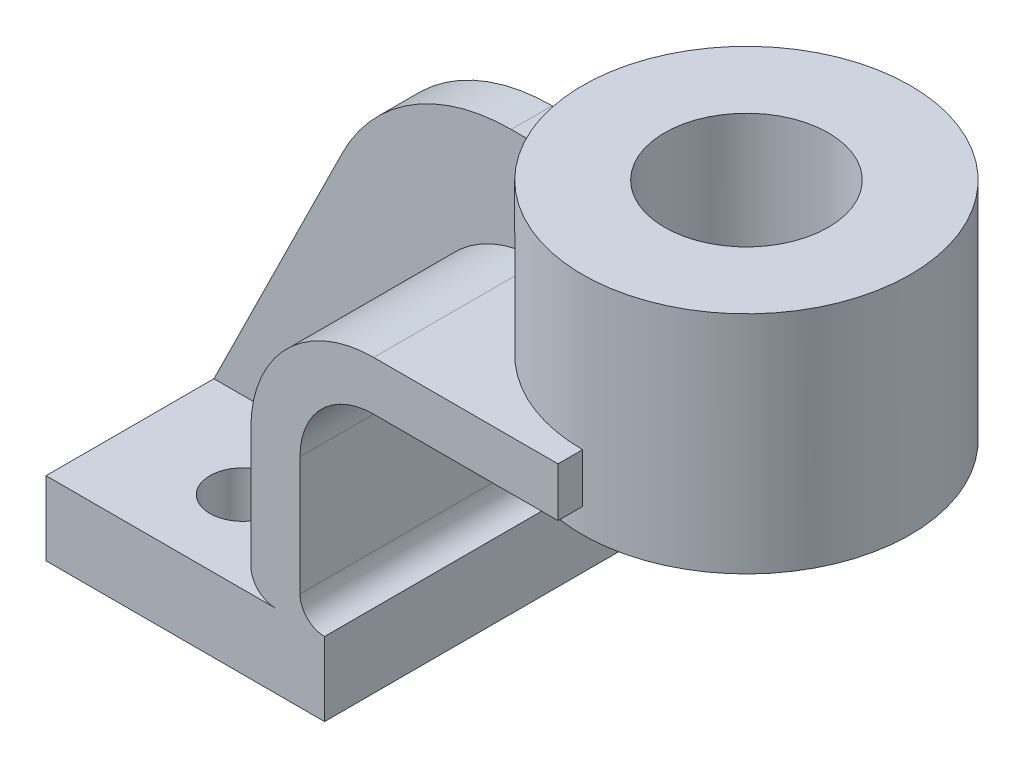
ISO-10303-21;
HEADER;
FILE_DESCRIPTION(('STEP AP214'),'2;1');
FILE_NAME('part.step','',(''),(''),'','','');
FILE_SCHEMA(('AUTOMOTIVE_DESIGN { 1 0 10303 214 1 1 1 1 }'));
ENDSEC;
DATA;
#1=APPLICATION_CONTEXT('core data for automotive mechanical design processes');
#2=APPLICATION_PROTOCOL_DEFINITION('international standard','automotive_design',2000,#1);
#3=PRODUCT_CONTEXT('',#1,'mechanical');
#4=PRODUCT('Part','Part','',(#3));
#5=PRODUCT_RELATED_PRODUCT_CATEGORY('part','',(#4));
#6=PRODUCT_DEFINITION_FORMATION('','',#4);
#7=PRODUCT_DEFINITION_CONTEXT('part definition',#1,'design');
#8=PRODUCT_DEFINITION('design','',#6,#7);
#9=PRODUCT_DEFINITION_SHAPE('','',#8);
#10=(LENGTH_UNIT() NAMED_UNIT(*) SI_UNIT(.MILLI.,.METRE.));
#11=(NAMED_UNIT(*) PLANE_ANGLE_UNIT() SI_UNIT($,.RADIAN.));
#12=(NAMED_UNIT(*) SI_UNIT($,.STERADIAN.) SOLID_ANGLE_UNIT());
#13=UNCERTAINTY_MEASURE_WITH_UNIT(LENGTH_MEASURE(1.E-05),#10,'distance_accuracy_value','');
#14=(GEOMETRIC_REPRESENTATION_CONTEXT(3) GLOBAL_UNCERTAINTY_ASSIGNED_CONTEXT((#13)) GLOBAL_UNIT_ASSIGNED_CONTEXT((#10,
#11,#12)) REPRESENTATION_CONTEXT('',''));
#15=CARTESIAN_POINT('',(0.,0.,0.));
#16=DIRECTION('',(0.,0.,1.));
#17=DIRECTION('',(1.,0.,0.));
#18=AXIS2_PLACEMENT_3D('',#15,#16,#17);
#19=CARTESIAN_POINT('',(-68.,18.,-92.));
#20=DIRECTION('',(0.,1.,0.));
#21=DIRECTION('',(0.,0.,1.));
#22=AXIS2_PLACEMENT_3D('',#19,#20,#21);
#23=PLANE('',#22);
#24=CARTESIAN_POINT('',(-40.,18.,-72.));
#25=DIRECTION('',(0.,1.,0.));
#26=DIRECTION('',(0.,0.,1.));
#27=AXIS2_PLACEMENT_3D('',#24,#25,#26);
#28=CIRCLE('',#27,7.99999999999998);
#29=CARTESIAN_POINT('',(-40.,18.,-64.));
#30=VERTEX_POINT('',#29);
#31=EDGE_CURVE('E479',#30,#30,#28,.F.);
#32=ORIENTED_EDGE('',*,*,#31,.T.);
#33=EDGE_LOOP('',(#32));
#34=FACE_BOUND('',#33,.T.);
#35=DIRECTION('',(0.,0.,1.));
#36=VECTOR('',#35,1.);
#37=CARTESIAN_POINT('',(-68.,18.,-92.));
#38=LINE('',#37,#36);
#39=CARTESIAN_POINT('',(-68.,18.,-92.));
#40=VERTEX_POINT('',#39);
#41=CARTESIAN_POINT('',(-68.,18.,-51.));
#42=VERTEX_POINT('',#41);
#43=EDGE_CURVE('E320',#40,#42,#38,.T.);
#44=ORIENTED_EDGE('',*,*,#43,.T.);
#45=DIRECTION('',(1.,0.,0.));
#46=VECTOR('',#45,1.);
#47=CARTESIAN_POINT('',(0.,18.,-51.));
#48=LINE('',#47,#46);
#49=CARTESIAN_POINT('',(-12.,18.,-51.));
#50=VERTEX_POINT('',#49);
#51=EDGE_CURVE('E492',#42,#50,#48,.T.);
#52=ORIENTED_EDGE('',*,*,#51,.T.);
#53=DIRECTION('',(0.,0.,1.));
#54=VECTOR('',#53,1.);
#55=CARTESIAN_POINT('',(-12.,18.,-92.));
#56=LINE('',#55,#54);
#57=CARTESIAN_POINT('',(-12.,18.,-92.));
#58=VERTEX_POINT('',#57);
#59=EDGE_CURVE('E238',#58,#50,#56,.T.);
#60=ORIENTED_EDGE('',*,*,#59,.F.);
#61=DIRECTION('',(-1.,0.,0.));
#62=VECTOR('',#61,1.);
#63=CARTESIAN_POINT('',(-68.,18.,-92.));
#64=LINE('',#63,#62);
#65=EDGE_CURVE('E405',#58,#40,#64,.T.);
#66=ORIENTED_EDGE('',*,*,#65,.T.);
#67=EDGE_LOOP('',(#44,#52,#60,#66));
#68=FACE_BOUND('',#67,.T.);
#69=ADVANCED_FACE('F47',(#34,#68),#23,.T.);
#70=CARTESIAN_POINT('',(-12.,24.,-92.));
#71=DIRECTION('',(0.,0.,1.));
#72=DIRECTION('',(1.,0.,0.));
#73=AXIS2_PLACEMENT_3D('',#70,#71,#72);
#74=CYLINDRICAL_SURFACE('',#73,6.00000000000001);
#75=ORIENTED_EDGE('',*,*,#59,.T.);
#76=CARTESIAN_POINT('',(-12.,24.,-51.));
#77=DIRECTION('',(0.,0.,1.));
#78=DIRECTION('',(1.,0.,0.));
#79=AXIS2_PLACEMENT_3D('',#76,#77,#78);
#80=CIRCLE('',#79,6.00000000000001);
#81=CARTESIAN_POINT('',(-18.,24.,-51.));
#82=VERTEX_POINT('',#81);
#83=EDGE_CURVE('E223',#82,#50,#80,.T.);
#84=ORIENTED_EDGE('',*,*,#83,.F.);
#85=DIRECTION('',(0.,0.,1.));
#86=VECTOR('',#85,1.);
#87=CARTESIAN_POINT('',(-18.,24.,-92.));
#88=LINE('',#87,#86);
#89=CARTESIAN_POINT('',(-18.,24.,-92.));
#90=VERTEX_POINT('',#89);
#91=EDGE_CURVE('E236',#90,#82,#88,.T.);
#92=ORIENTED_EDGE('',*,*,#91,.F.);
#93=CARTESIAN_POINT('',(-12.,24.,-92.));
#94=DIRECTION('',(0.,0.,1.));
#95=DIRECTION('',(1.,0.,0.));
#96=AXIS2_PLACEMENT_3D('',#93,#94,#95);
#97=CIRCLE('',#96,6.00000000000001);
#98=EDGE_CURVE('E409',#90,#58,#97,.T.);
#99=ORIENTED_EDGE('',*,*,#98,.T.);
#100=EDGE_LOOP('',(#75,#84,#92,#99));
#101=FACE_BOUND('',#100,.T.);
#102=ADVANCED_FACE('F234',(#101),#74,.T.);
#103=CARTESIAN_POINT('',(-18.,53.,-92.));
#104=DIRECTION('',(-1.,0.,0.));
#105=DIRECTION('',(0.,-1.,0.));
#106=AXIS2_PLACEMENT_3D('',#103,#104,#105);
#107=PLANE('',#106);
#108=ORIENTED_EDGE('',*,*,#91,.T.);
#109=DIRECTION('',(0.,-1.,0.));
#110=VECTOR('',#109,1.);
#111=CARTESIAN_POINT('',(-18.,0.,-51.));
#112=LINE('',#111,#110);
#113=CARTESIAN_POINT('',(-18.,53.,-51.));
#114=VERTEX_POINT('',#113);
#115=EDGE_CURVE('E219',#114,#82,#112,.T.);
#116=ORIENTED_EDGE('',*,*,#115,.F.);
#117=DIRECTION('',(0.,0.,1.));
#118=VECTOR('',#117,1.);
#119=CARTESIAN_POINT('',(-18.,53.,-92.));
#120=LINE('',#119,#118);
#121=CARTESIAN_POINT('',(-18.,53.,-92.));
#122=VERTEX_POINT('',#121);
#123=EDGE_CURVE('E253',#122,#114,#120,.T.);
#124=ORIENTED_EDGE('',*,*,#123,.F.);
#125=DIRECTION('',(0.,-1.,0.));
#126=VECTOR('',#125,1.);
#127=CARTESIAN_POINT('',(-18.,53.,-92.));
#128=LINE('',#127,#126);
#129=EDGE_CURVE('E245',#122,#90,#128,.T.);
#130=ORIENTED_EDGE('',*,*,#129,.T.);
#131=EDGE_LOOP('',(#108,#116,#124,#130));
#132=FACE_BOUND('',#131,.T.);
#133=ADVANCED_FACE('F243',(#132),#107,.T.);
#134=CARTESIAN_POINT('',(12.,53.,-92.));
#135=DIRECTION('',(0.,0.,1.));
#136=DIRECTION('',(1.,0.,0.));
#137=AXIS2_PLACEMENT_3D('',#134,#135,#136);
#138=CYLINDRICAL_SURFACE('',#137,30.);
#139=ORIENTED_EDGE('',*,*,#123,.T.);
#140=CARTESIAN_POINT('',(12.,53.,-51.));
#141=DIRECTION('',(0.,0.,1.));
#142=DIRECTION('',(1.,0.,0.));
#143=AXIS2_PLACEMENT_3D('',#140,#141,#142);
#144=CIRCLE('',#143,30.);
#145=CARTESIAN_POINT('',(12.,83.,-51.));
#146=VERTEX_POINT('',#145);
#147=EDGE_CURVE('E226',#114,#146,#144,.F.);
#148=ORIENTED_EDGE('',*,*,#147,.T.);
#149=DIRECTION('',(0.,0.,1.));
#150=VECTOR('',#149,1.);
#151=CARTESIAN_POINT('',(12.,83.,-92.));
#152=LINE('',#151,#150);
#153=CARTESIAN_POINT('',(12.,83.,-92.));
#154=VERTEX_POINT('',#153);
#155=EDGE_CURVE('E259',#154,#146,#152,.T.);
#156=ORIENTED_EDGE('',*,*,#155,.F.);
#157=CARTESIAN_POINT('',(12.,53.,-92.));
#158=DIRECTION('',(0.,0.,1.));
#159=DIRECTION('',(-1.,0.,0.));
#160=AXIS2_PLACEMENT_3D('',#157,#158,#159);
#161=CIRCLE('',#160,30.);
#162=EDGE_CURVE('E414',#154,#122,#161,.T.);
#163=ORIENTED_EDGE('',*,*,#162,.T.);
#164=EDGE_LOOP('',(#139,#148,#156,#163));
#165=FACE_BOUND('',#164,.T.);
#166=ADVANCED_FACE('F530',(#165),#138,.T.);
#167=CARTESIAN_POINT('',(12.,83.,-92.));
#168=DIRECTION('',(0.,1.,0.));
#169=DIRECTION('',(0.,0.,1.));
#170=AXIS2_PLACEMENT_3D('',#167,#168,#169);
#171=PLANE('',#170);
#172=ORIENTED_EDGE('',*,*,#155,.T.);
#173=DIRECTION('',(1.,0.,0.));
#174=VECTOR('',#173,1.);
#175=CARTESIAN_POINT('',(0.,83.,-51.));
#176=LINE('',#175,#174);
#177=CARTESIAN_POINT('',(17.3137303340311,83.,-51.));
#178=VERTEX_POINT('',#177);
#179=EDGE_CURVE('E524',#146,#178,#176,.T.);
#180=ORIENTED_EDGE('',*,*,#179,.T.);
#181=CARTESIAN_POINT('',(57.,83.,-46.));
#182=DIRECTION('',(0.,1.,0.));
#183=DIRECTION('',(0.,0.,1.));
#184=AXIS2_PLACEMENT_3D('',#181,#182,#183);
#185=CIRCLE('',#184,40.);
#186=CARTESIAN_POINT('',(57.,83.,-86.));
#187=VERTEX_POINT('',#186);
#188=EDGE_CURVE('E436',#178,#187,#185,.F.);
#189=ORIENTED_EDGE('',*,*,#188,.T.);
#190=DIRECTION('',(0.,0.,1.));
#191=VECTOR('',#190,1.);
#192=CARTESIAN_POINT('',(57.,83.,-92.));
#193=LINE('',#192,#191);
#194=CARTESIAN_POINT('',(57.,83.,-92.));
#195=VERTEX_POINT('',#194);
#196=EDGE_CURVE('E264',#195,#187,#193,.T.);
#197=ORIENTED_EDGE('',*,*,#196,.F.);
#198=DIRECTION('',(-1.,0.,0.));
#199=VECTOR('',#198,1.);
#200=CARTESIAN_POINT('',(12.,83.,-92.));
#201=LINE('',#200,#199);
#202=EDGE_CURVE('E418',#195,#154,#201,.T.);
#203=ORIENTED_EDGE('',*,*,#202,.T.);
#204=EDGE_LOOP('',(#172,#180,#189,#197,#203));
#205=FACE_BOUND('',#204,.T.);
#206=ADVANCED_FACE('F533',(#205),#171,.T.);
#207=CARTESIAN_POINT('',(57.,353.137084989848,-46.));
#208=DIRECTION('',(0.,-1.,0.));
#209=DIRECTION('',(0.,0.,-1.));
#210=AXIS2_PLACEMENT_3D('',#207,#208,#209);
#211=CYLINDRICAL_SURFACE('',#210,40.);
#212=CARTESIAN_POINT('',(57.,65.,-46.));
#213=DIRECTION('',(0.,-1.,0.));
#214=DIRECTION('',(0.,0.,-1.));
#215=AXIS2_PLACEMENT_3D('',#212,#213,#214);
#216=CIRCLE('',#215,40.);
#217=CARTESIAN_POINT('',(57.,65.,-86.));
#218=VERTEX_POINT('',#217);
#219=EDGE_CURVE('E466',#218,#218,#216,.F.);
#220=ORIENTED_EDGE('',*,*,#219,.T.);
#221=EDGE_LOOP('',(#220));
#222=FACE_BOUND('',#221,.T.);
#223=CARTESIAN_POINT('',(57.,120.,-46.));
#224=DIRECTION('',(0.,-1.,0.));
#225=DIRECTION('',(1.,0.,0.));
#226=AXIS2_PLACEMENT_3D('',#223,#224,#225);
#227=CIRCLE('',#226,40.);
#228=CARTESIAN_POINT('',(97.,120.,-46.));
#229=VERTEX_POINT('',#228);
#230=EDGE_CURVE('E461',#229,#229,#227,.T.);
#231=ORIENTED_EDGE('',*,*,#230,.T.);
#232=EDGE_LOOP('',(#231));
#233=FACE_BOUND('',#232,.T.);
#234=DIRECTION('',(0.,-1.,0.));
#235=VECTOR('',#234,1.);
#236=CARTESIAN_POINT('',(17.3137303340311,353.137084989848,-51.));
#237=LINE('',#236,#235);
#238=CARTESIAN_POINT('',(17.3137303340311,107.,-51.));
#239=VERTEX_POINT('',#238);
#240=EDGE_CURVE('E297',#239,#178,#237,.T.);
#241=ORIENTED_EDGE('',*,*,#240,.F.);
#242=CARTESIAN_POINT('',(57.,107.,-46.));
#243=DIRECTION('',(0.,1.,0.));
#244=DIRECTION('',(0.,0.,1.));
#245=AXIS2_PLACEMENT_3D('',#242,#243,#244);
#246=CIRCLE('',#245,40.);
#247=CARTESIAN_POINT('',(17.3137303340311,107.,-41.));
#248=VERTEX_POINT('',#247);
#249=EDGE_CURVE('E293',#239,#248,#246,.T.);
#250=ORIENTED_EDGE('',*,*,#249,.T.);
#251=DIRECTION('',(0.,-1.,0.));
#252=VECTOR('',#251,1.);
#253=CARTESIAN_POINT('',(17.3137303340311,353.137084989848,-41.));
#254=LINE('',#253,#252);
#255=CARTESIAN_POINT('',(17.3137303340311,83.,-41.));
#256=VERTEX_POINT('',#255);
#257=EDGE_CURVE('E289',#248,#256,#254,.T.);
#258=ORIENTED_EDGE('',*,*,#257,.T.);
#259=CARTESIAN_POINT('',(57.,83.,-6.));
#260=VERTEX_POINT('',#259);
#261=EDGE_CURVE('E385',#260,#256,#185,.F.);
#262=ORIENTED_EDGE('',*,*,#261,.F.);
#263=DIRECTION('',(0.,-1.,0.));
#264=VECTOR('',#263,1.);
#265=CARTESIAN_POINT('',(57.,353.137084989848,-6.));
#266=LINE('',#265,#264);
#267=CARTESIAN_POINT('',(57.,71.,-5.99999999999999));
#268=VERTEX_POINT('',#267);
#269=EDGE_CURVE('E437',#268,#260,#266,.F.);
#270=ORIENTED_EDGE('',*,*,#269,.F.);
#271=CARTESIAN_POINT('',(57.,71.,-46.));
#272=DIRECTION('',(0.,-1.,0.));
#273=DIRECTION('',(0.,0.,-1.));
#274=AXIS2_PLACEMENT_3D('',#271,#272,#273);
#275=CIRCLE('',#274,40.);
#276=CARTESIAN_POINT('',(57.,71.,-86.));
#277=VERTEX_POINT('',#276);
#278=EDGE_CURVE('E284',#277,#268,#275,.F.);
#279=ORIENTED_EDGE('',*,*,#278,.F.);
#280=DIRECTION('',(0.,-1.,0.));
#281=VECTOR('',#280,1.);
#282=CARTESIAN_POINT('',(57.,353.137084989848,-86.));
#283=LINE('',#282,#281);
#284=EDGE_CURVE('E441',#187,#277,#283,.T.);
#285=ORIENTED_EDGE('',*,*,#284,.F.);
#286=ORIENTED_EDGE('',*,*,#188,.F.);
#287=EDGE_LOOP('',(#241,#250,#258,#262,#270,#279,#285,#286));
#288=FACE_BOUND('',#287,.T.);
#289=ADVANCED_FACE('F584',(#222,#233,#288),#211,.T.);
#290=CARTESIAN_POINT('',(0.,0.,-92.));
#291=DIRECTION('',(0.,-1.,0.));
#292=DIRECTION('',(1.,0.,0.));
#293=AXIS2_PLACEMENT_3D('',#290,#291,#292);
#294=PLANE('',#293);
#295=CARTESIAN_POINT('',(-40.,0.,-72.));
#296=DIRECTION('',(0.,-1.,0.));
#297=DIRECTION('',(1.,0.,0.));
#298=AXIS2_PLACEMENT_3D('',#295,#296,#297);
#299=CIRCLE('',#298,7.99999999999998);
#300=CARTESIAN_POINT('',(-40.,0.,-64.));
#301=VERTEX_POINT('',#300);
#302=EDGE_CURVE('E474',#301,#301,#299,.T.);
#303=ORIENTED_EDGE('',*,*,#302,.F.);
#304=EDGE_LOOP('',(#303));
#305=FACE_BOUND('',#304,.T.);
#306=DIRECTION('',(1.,0.,0.));
#307=VECTOR('',#306,1.);
#308=CARTESIAN_POINT('',(0.,0.,0.));
#309=LINE('',#308,#307);
#310=CARTESIAN_POINT('',(-68.,0.,0.));
#311=VERTEX_POINT('',#310);
#312=CARTESIAN_POINT('',(0.,0.,0.));
#313=VERTEX_POINT('',#312);
#314=EDGE_CURVE('E345',#311,#313,#309,.T.);
#315=ORIENTED_EDGE('',*,*,#314,.F.);
#316=DIRECTION('',(0.,0.,1.));
#317=VECTOR('',#316,1.);
#318=CARTESIAN_POINT('',(-68.,0.,-92.));
#319=LINE('',#318,#317);
#320=CARTESIAN_POINT('',(-68.,0.,-92.));
#321=VERTEX_POINT('',#320);
#322=EDGE_CURVE('E317',#321,#311,#319,.T.);
#323=ORIENTED_EDGE('',*,*,#322,.F.);
#324=DIRECTION('',(1.,0.,0.));
#325=VECTOR('',#324,1.);
#326=CARTESIAN_POINT('',(0.,0.,-92.));
#327=LINE('',#326,#325);
#328=CARTESIAN_POINT('',(0.,0.,-92.));
#329=VERTEX_POINT('',#328);
#330=EDGE_CURVE('E397',#321,#329,#327,.T.);
#331=ORIENTED_EDGE('',*,*,#330,.T.);
#332=DIRECTION('',(0.,0.,1.));
#333=VECTOR('',#332,1.);
#334=CARTESIAN_POINT('',(0.,0.,-92.));
#335=LINE('',#334,#333);
#336=EDGE_CURVE('E314',#329,#313,#335,.T.);
#337=ORIENTED_EDGE('',*,*,#336,.T.);
#338=EDGE_LOOP('',(#315,#323,#331,#337));
#339=FACE_BOUND('',#338,.T.);
#340=CARTESIAN_POINT('',(-40.,0.,-20.));
#341=DIRECTION('',(0.,-1.,0.));
#342=DIRECTION('',(1.,0.,0.));
#343=AXIS2_PLACEMENT_3D('',#340,#341,#342);
#344=CIRCLE('',#343,8.);
#345=CARTESIAN_POINT('',(-40.,0.,-12.));
#346=VERTEX_POINT('',#345);
#347=EDGE_CURVE('E470',#346,#346,#344,.F.);
#348=ORIENTED_EDGE('',*,*,#347,.T.);
#349=EDGE_LOOP('',(#348));
#350=FACE_BOUND('',#349,.T.);
#351=ADVANCED_FACE('F565',(#305,#339,#350),#294,.T.);
#352=DIRECTION('',(1.,0.,0.));
#353=VECTOR('',#352,1.);
#354=CARTESIAN_POINT('',(0.,18.,-41.));
#355=LINE('',#354,#353);
#356=CARTESIAN_POINT('',(-68.,18.,-41.));
#357=VERTEX_POINT('',#356);
#358=CARTESIAN_POINT('',(-12.,18.,-41.));
#359=VERTEX_POINT('',#358);
#360=EDGE_CURVE('E240',#357,#359,#355,.T.);
#361=ORIENTED_EDGE('',*,*,#360,.F.);
#362=CARTESIAN_POINT('',(-68.,18.,0.));
#363=VERTEX_POINT('',#362);
#364=EDGE_CURVE('E324',#357,#363,#38,.T.);
#365=ORIENTED_EDGE('',*,*,#364,.T.);
#366=DIRECTION('',(-1.,0.,0.));
#367=VECTOR('',#366,1.);
#368=CARTESIAN_POINT('',(-68.,18.,0.));
#369=LINE('',#368,#367);
#370=CARTESIAN_POINT('',(-12.,18.,0.));
#371=VERTEX_POINT('',#370);
#372=EDGE_CURVE('E353',#371,#363,#369,.T.);
#373=ORIENTED_EDGE('',*,*,#372,.F.);
#374=EDGE_CURVE('E247',#359,#371,#56,.T.);
#375=ORIENTED_EDGE('',*,*,#374,.F.);
#376=EDGE_LOOP('',(#361,#365,#373,#375));
#377=FACE_BOUND('',#376,.T.);
#378=CARTESIAN_POINT('',(-40.,18.,-20.));
#379=DIRECTION('',(0.,1.,0.));
#380=DIRECTION('',(0.,0.,1.));
#381=AXIS2_PLACEMENT_3D('',#378,#379,#380);
#382=CIRCLE('',#381,8.);
#383=CARTESIAN_POINT('',(-40.,18.,-12.));
#384=VERTEX_POINT('',#383);
#385=EDGE_CURVE('E478',#384,#384,#382,.T.);
#386=ORIENTED_EDGE('',*,*,#385,.F.);
#387=EDGE_LOOP('',(#386));
#388=FACE_BOUND('',#387,.T.);
#389=ADVANCED_FACE('F623',(#377,#388),#23,.T.);
#390=CARTESIAN_POINT('',(57.,83.,-92.));
#391=DIRECTION('',(1.,0.,0.));
#392=DIRECTION('',(0.,0.,-1.));
#393=AXIS2_PLACEMENT_3D('',#390,#391,#392);
#394=PLANE('',#393);
#395=DIRECTION('',(0.,0.,1.));
#396=VECTOR('',#395,1.);
#397=CARTESIAN_POINT('',(57.,71.,-92.));
#398=LINE('',#397,#396);
#399=CARTESIAN_POINT('',(57.,71.,0.));
#400=VERTEX_POINT('',#399);
#401=EDGE_CURVE('E275',#268,#400,#398,.T.);
#402=ORIENTED_EDGE('',*,*,#401,.F.);
#403=ORIENTED_EDGE('',*,*,#269,.T.);
#404=CARTESIAN_POINT('',(57.,83.,0.));
#405=VERTEX_POINT('',#404);
#406=EDGE_CURVE('E269',#260,#405,#193,.T.);
#407=ORIENTED_EDGE('',*,*,#406,.T.);
#408=DIRECTION('',(0.,1.,0.));
#409=VECTOR('',#408,1.);
#410=CARTESIAN_POINT('',(57.,83.,0.));
#411=LINE('',#410,#409);
#412=EDGE_CURVE('E373',#400,#405,#411,.T.);
#413=ORIENTED_EDGE('',*,*,#412,.F.);
#414=EDGE_LOOP('',(#402,#403,#407,#413));
#415=FACE_BOUND('',#414,.T.);
#416=ADVANCED_FACE('F608',(#415),#394,.T.);
#417=ORIENTED_EDGE('',*,*,#196,.T.);
#418=ORIENTED_EDGE('',*,*,#284,.T.);
#419=CARTESIAN_POINT('',(57.,71.,-92.));
#420=VERTEX_POINT('',#419);
#421=EDGE_CURVE('E270',#420,#277,#398,.T.);
#422=ORIENTED_EDGE('',*,*,#421,.F.);
#423=DIRECTION('',(0.,1.,0.));
#424=VECTOR('',#423,1.);
#425=CARTESIAN_POINT('',(57.,83.,-92.));
#426=LINE('',#425,#424);
#427=EDGE_CURVE('E422',#420,#195,#426,.T.);
#428=ORIENTED_EDGE('',*,*,#427,.T.);
#429=EDGE_LOOP('',(#417,#418,#422,#428));
#430=FACE_BOUND('',#429,.T.);
#431=ADVANCED_FACE('F542',(#430),#394,.T.);
#432=CARTESIAN_POINT('',(12.,53.,-92.));
#433=DIRECTION('',(0.,0.,1.));
#434=DIRECTION('',(1.,0.,0.));
#435=AXIS2_PLACEMENT_3D('',#432,#433,#434);
#436=CYLINDRICAL_SURFACE('',#435,18.);
#437=CARTESIAN_POINT('',(12.,53.,0.));
#438=DIRECTION('',(0.,0.,-1.));
#439=DIRECTION('',(-1.,0.,0.));
#440=AXIS2_PLACEMENT_3D('',#437,#438,#439);
#441=CIRCLE('',#440,18.);
#442=CARTESIAN_POINT('',(-6.,53.,0.));
#443=VERTEX_POINT('',#442);
#444=CARTESIAN_POINT('',(12.,71.,0.));
#445=VERTEX_POINT('',#444);
#446=EDGE_CURVE('E381',#443,#445,#441,.T.);
#447=ORIENTED_EDGE('',*,*,#446,.F.);
#448=DIRECTION('',(0.,0.,1.));
#449=VECTOR('',#448,1.);
#450=CARTESIAN_POINT('',(-6.,53.,-92.));
#451=LINE('',#450,#449);
#452=CARTESIAN_POINT('',(-6.,53.,-92.));
#453=VERTEX_POINT('',#452);
#454=EDGE_CURVE('E285',#453,#443,#451,.T.);
#455=ORIENTED_EDGE('',*,*,#454,.F.);
#456=CARTESIAN_POINT('',(12.,53.,-92.));
#457=DIRECTION('',(0.,0.,-1.));
#458=DIRECTION('',(-1.,0.,0.));
#459=AXIS2_PLACEMENT_3D('',#456,#457,#458);
#460=CIRCLE('',#459,18.);
#461=CARTESIAN_POINT('',(12.,71.,-92.));
#462=VERTEX_POINT('',#461);
#463=EDGE_CURVE('E336',#453,#462,#460,.T.);
#464=ORIENTED_EDGE('',*,*,#463,.T.);
#465=DIRECTION('',(0.,0.,1.));
#466=VECTOR('',#465,1.);
#467=CARTESIAN_POINT('',(12.,71.,-92.));
#468=LINE('',#467,#466);
#469=EDGE_CURVE('E276',#462,#445,#468,.T.);
#470=ORIENTED_EDGE('',*,*,#469,.T.);
#471=EDGE_LOOP('',(#447,#455,#464,#470));
#472=FACE_BOUND('',#471,.T.);
#473=ADVANCED_FACE('F551',(#472),#436,.F.);
#474=CARTESIAN_POINT('',(-6.,53.,-92.));
#475=DIRECTION('',(1.,0.,0.));
#476=DIRECTION('',(0.,1.,0.));
#477=AXIS2_PLACEMENT_3D('',#474,#475,#476);
#478=PLANE('',#477);
#479=DIRECTION('',(0.,1.,0.));
#480=VECTOR('',#479,1.);
#481=CARTESIAN_POINT('',(-6.,53.,0.));
#482=LINE('',#481,#480);
#483=CARTESIAN_POINT('',(-6.,24.,0.));
#484=VERTEX_POINT('',#483);
#485=EDGE_CURVE('E332',#484,#443,#482,.T.);
#486=ORIENTED_EDGE('',*,*,#485,.F.);
#487=DIRECTION('',(0.,0.,1.));
#488=VECTOR('',#487,1.);
#489=CARTESIAN_POINT('',(-6.,24.,-92.));
#490=LINE('',#489,#488);
#491=CARTESIAN_POINT('',(-6.,24.,-92.));
#492=VERTEX_POINT('',#491);
#493=EDGE_CURVE('E308',#492,#484,#490,.T.);
#494=ORIENTED_EDGE('',*,*,#493,.F.);
#495=DIRECTION('',(0.,1.,0.));
#496=VECTOR('',#495,1.);
#497=CARTESIAN_POINT('',(-6.,53.,-92.));
#498=LINE('',#497,#496);
#499=EDGE_CURVE('E279',#492,#453,#498,.T.);
#500=ORIENTED_EDGE('',*,*,#499,.T.);
#501=ORIENTED_EDGE('',*,*,#454,.T.);
#502=EDGE_LOOP('',(#486,#494,#500,#501));
#503=FACE_BOUND('',#502,.T.);
#504=ADVANCED_FACE('F554',(#503),#478,.T.);
#505=CARTESIAN_POINT('',(0.,24.,-92.));
#506=DIRECTION('',(0.,0.,1.));
#507=DIRECTION('',(1.,0.,0.));
#508=AXIS2_PLACEMENT_3D('',#505,#506,#507);
#509=CYLINDRICAL_SURFACE('',#508,6.);
#510=CARTESIAN_POINT('',(0.,24.,0.));
#511=DIRECTION('',(0.,0.,-1.));
#512=DIRECTION('',(1.,0.,0.));
#513=AXIS2_PLACEMENT_3D('',#510,#511,#512);
#514=CIRCLE('',#513,6.);
#515=CARTESIAN_POINT('',(0.,18.,0.));
#516=VERTEX_POINT('',#515);
#517=EDGE_CURVE('E337',#516,#484,#514,.T.);
#518=ORIENTED_EDGE('',*,*,#517,.F.);
#519=DIRECTION('',(0.,0.,1.));
#520=VECTOR('',#519,1.);
#521=CARTESIAN_POINT('',(0.,18.,-92.));
#522=LINE('',#521,#520);
#523=CARTESIAN_POINT('',(0.,18.,-92.));
#524=VERTEX_POINT('',#523);
#525=EDGE_CURVE('E311',#524,#516,#522,.T.);
#526=ORIENTED_EDGE('',*,*,#525,.F.);
#527=CARTESIAN_POINT('',(0.,24.,-92.));
#528=DIRECTION('',(0.,0.,-1.));
#529=DIRECTION('',(1.,0.,0.));
#530=AXIS2_PLACEMENT_3D('',#527,#528,#529);
#531=CIRCLE('',#530,6.);
#532=EDGE_CURVE('E389',#524,#492,#531,.T.);
#533=ORIENTED_EDGE('',*,*,#532,.T.);
#534=ORIENTED_EDGE('',*,*,#493,.T.);
#535=EDGE_LOOP('',(#518,#526,#533,#534));
#536=FACE_BOUND('',#535,.T.);
#537=ADVANCED_FACE('F611',(#536),#509,.F.);
#538=CARTESIAN_POINT('',(0.,18.,-92.));
#539=DIRECTION('',(1.,0.,0.));
#540=DIRECTION('',(0.,0.,-1.));
#541=AXIS2_PLACEMENT_3D('',#538,#539,#540);
#542=PLANE('',#541);
#543=DIRECTION('',(0.,1.,0.));
#544=VECTOR('',#543,1.);
#545=CARTESIAN_POINT('',(0.,18.,0.));
#546=LINE('',#545,#544);
#547=EDGE_CURVE('E341',#313,#516,#546,.T.);
#548=ORIENTED_EDGE('',*,*,#547,.F.);
#549=ORIENTED_EDGE('',*,*,#336,.F.);
#550=DIRECTION('',(0.,1.,0.));
#551=VECTOR('',#550,1.);
#552=CARTESIAN_POINT('',(0.,18.,-92.));
#553=LINE('',#552,#551);
#554=EDGE_CURVE('E393',#329,#524,#553,.T.);
#555=ORIENTED_EDGE('',*,*,#554,.T.);
#556=ORIENTED_EDGE('',*,*,#525,.T.);
#557=EDGE_LOOP('',(#548,#549,#555,#556));
#558=FACE_BOUND('',#557,.T.);
#559=ADVANCED_FACE('F561',(#558),#542,.T.);
#560=CARTESIAN_POINT('',(-68.,0.,-92.));
#561=DIRECTION('',(-1.,0.,0.));
#562=DIRECTION('',(0.,0.,1.));
#563=AXIS2_PLACEMENT_3D('',#560,#561,#562);
#564=PLANE('',#563);
#565=DIRECTION('',(0.,-1.,0.));
#566=VECTOR('',#565,1.);
#567=CARTESIAN_POINT('',(-68.,0.,0.));
#568=LINE('',#567,#566);
#569=EDGE_CURVE('E349',#363,#311,#568,.T.);
#570=ORIENTED_EDGE('',*,*,#569,.F.);
#571=ORIENTED_EDGE('',*,*,#364,.F.);
#572=DIRECTION('',(0.,0.,1.));
#573=VECTOR('',#572,1.);
#574=CARTESIAN_POINT('',(-68.,18.,-51.));
#575=LINE('',#574,#573);
#576=EDGE_CURVE('E483',#42,#357,#575,.T.);
#577=ORIENTED_EDGE('',*,*,#576,.F.);
#578=ORIENTED_EDGE('',*,*,#43,.F.);
#579=DIRECTION('',(0.,-1.,0.));
#580=VECTOR('',#579,1.);
#581=CARTESIAN_POINT('',(-68.,0.,-92.));
#582=LINE('',#581,#580);
#583=EDGE_CURVE('E401',#40,#321,#582,.T.);
#584=ORIENTED_EDGE('',*,*,#583,.T.);
#585=ORIENTED_EDGE('',*,*,#322,.T.);
#586=EDGE_LOOP('',(#570,#571,#577,#578,#584,#585));
#587=FACE_BOUND('',#586,.T.);
#588=ADVANCED_FACE('F570',(#587),#564,.T.);
#589=CARTESIAN_POINT('',(-12.,24.,-41.));
#590=DIRECTION('',(0.,0.,1.));
#591=DIRECTION('',(1.,0.,0.));
#592=AXIS2_PLACEMENT_3D('',#589,#590,#591);
#593=CIRCLE('',#592,6.00000000000001);
#594=CARTESIAN_POINT('',(-18.,24.,-41.));
#595=VERTEX_POINT('',#594);
#596=EDGE_CURVE('E511',#595,#359,#593,.T.);
#597=ORIENTED_EDGE('',*,*,#596,.T.);
#598=ORIENTED_EDGE('',*,*,#374,.T.);
#599=CARTESIAN_POINT('',(-12.,24.,0.));
#600=DIRECTION('',(0.,0.,1.));
#601=DIRECTION('',(1.,0.,0.));
#602=AXIS2_PLACEMENT_3D('',#599,#600,#601);
#603=CIRCLE('',#602,6.00000000000001);
#604=CARTESIAN_POINT('',(-18.,24.,0.));
#605=VERTEX_POINT('',#604);
#606=EDGE_CURVE('E357',#605,#371,#603,.T.);
#607=ORIENTED_EDGE('',*,*,#606,.F.);
#608=EDGE_CURVE('E248',#595,#605,#88,.T.);
#609=ORIENTED_EDGE('',*,*,#608,.F.);
#610=EDGE_LOOP('',(#597,#598,#607,#609));
#611=FACE_BOUND('',#610,.T.);
#612=ADVANCED_FACE('F629',(#611),#74,.T.);
#613=DIRECTION('',(0.,-1.,0.));
#614=VECTOR('',#613,1.);
#615=CARTESIAN_POINT('',(-18.,0.,-41.));
#616=LINE('',#615,#614);
#617=CARTESIAN_POINT('',(-18.,53.,-41.));
#618=VERTEX_POINT('',#617);
#619=EDGE_CURVE('E507',#618,#595,#616,.T.);
#620=ORIENTED_EDGE('',*,*,#619,.T.);
#621=ORIENTED_EDGE('',*,*,#608,.T.);
#622=DIRECTION('',(0.,-1.,0.));
#623=VECTOR('',#622,1.);
#624=CARTESIAN_POINT('',(-18.,53.,0.));
#625=LINE('',#624,#623);
#626=CARTESIAN_POINT('',(-18.,53.,0.));
#627=VERTEX_POINT('',#626);
#628=EDGE_CURVE('E361',#627,#605,#625,.T.);
#629=ORIENTED_EDGE('',*,*,#628,.F.);
#630=EDGE_CURVE('E258',#618,#627,#120,.T.);
#631=ORIENTED_EDGE('',*,*,#630,.F.);
#632=EDGE_LOOP('',(#620,#621,#629,#631));
#633=FACE_BOUND('',#632,.T.);
#634=ADVANCED_FACE('F764',(#633),#107,.T.);
#635=CARTESIAN_POINT('',(12.,53.,-41.));
#636=DIRECTION('',(0.,0.,1.));
#637=DIRECTION('',(1.,0.,0.));
#638=AXIS2_PLACEMENT_3D('',#635,#636,#637);
#639=CIRCLE('',#638,30.);
#640=CARTESIAN_POINT('',(12.,83.,-41.));
#641=VERTEX_POINT('',#640);
#642=EDGE_CURVE('E504',#618,#641,#639,.F.);
#643=ORIENTED_EDGE('',*,*,#642,.F.);
#644=ORIENTED_EDGE('',*,*,#630,.T.);
#645=CARTESIAN_POINT('',(12.,53.,0.));
#646=DIRECTION('',(0.,0.,1.));
#647=DIRECTION('',(-1.,0.,0.));
#648=AXIS2_PLACEMENT_3D('',#645,#646,#647);
#649=CIRCLE('',#648,30.);
#650=CARTESIAN_POINT('',(12.,83.,0.));
#651=VERTEX_POINT('',#650);
#652=EDGE_CURVE('E365',#651,#627,#649,.T.);
#653=ORIENTED_EDGE('',*,*,#652,.F.);
#654=EDGE_CURVE('E263',#641,#651,#152,.T.);
#655=ORIENTED_EDGE('',*,*,#654,.F.);
#656=EDGE_LOOP('',(#643,#644,#653,#655));
#657=FACE_BOUND('',#656,.T.);
#658=ADVANCED_FACE('F754',(#657),#138,.T.);
#659=DIRECTION('',(1.,0.,0.));
#660=VECTOR('',#659,1.);
#661=CARTESIAN_POINT('',(0.,83.,-41.));
#662=LINE('',#661,#660);
#663=EDGE_CURVE('E501',#641,#256,#662,.T.);
#664=ORIENTED_EDGE('',*,*,#663,.F.);
#665=ORIENTED_EDGE('',*,*,#654,.T.);
#666=DIRECTION('',(-1.,0.,0.));
#667=VECTOR('',#666,1.);
#668=CARTESIAN_POINT('',(12.,83.,0.));
#669=LINE('',#668,#667);
#670=EDGE_CURVE('E369',#405,#651,#669,.T.);
#671=ORIENTED_EDGE('',*,*,#670,.F.);
#672=ORIENTED_EDGE('',*,*,#406,.F.);
#673=ORIENTED_EDGE('',*,*,#261,.T.);
#674=EDGE_LOOP('',(#664,#665,#671,#672,#673));
#675=FACE_BOUND('',#674,.T.);
#676=ADVANCED_FACE('F587',(#675),#171,.T.);
#677=CARTESIAN_POINT('',(12.,71.,-92.));
#678=DIRECTION('',(0.,-1.,0.));
#679=DIRECTION('',(0.,0.,-1.));
#680=AXIS2_PLACEMENT_3D('',#677,#678,#679);
#681=PLANE('',#680);
#682=ORIENTED_EDGE('',*,*,#421,.T.);
#683=ORIENTED_EDGE('',*,*,#278,.T.);
#684=ORIENTED_EDGE('',*,*,#401,.T.);
#685=DIRECTION('',(1.,0.,0.));
#686=VECTOR('',#685,1.);
#687=CARTESIAN_POINT('',(12.,71.,0.));
#688=LINE('',#687,#686);
#689=EDGE_CURVE('E377',#445,#400,#688,.T.);
#690=ORIENTED_EDGE('',*,*,#689,.F.);
#691=ORIENTED_EDGE('',*,*,#469,.F.);
#692=DIRECTION('',(1.,0.,0.));
#693=VECTOR('',#692,1.);
#694=CARTESIAN_POINT('',(12.,71.,-92.));
#695=LINE('',#694,#693);
#696=EDGE_CURVE('E426',#462,#420,#695,.T.);
#697=ORIENTED_EDGE('',*,*,#696,.T.);
#698=EDGE_LOOP('',(#682,#683,#684,#690,#691,#697));
#699=FACE_BOUND('',#698,.T.);
#700=ADVANCED_FACE('F545',(#699),#681,.T.);
#701=CARTESIAN_POINT('',(12.,53.,-92.));
#702=DIRECTION('',(0.,0.,-1.));
#703=DIRECTION('',(-1.,0.,0.));
#704=AXIS2_PLACEMENT_3D('',#701,#702,#703);
#705=PLANE('',#704);
#706=ORIENTED_EDGE('',*,*,#463,.F.);
#707=ORIENTED_EDGE('',*,*,#499,.F.);
#708=ORIENTED_EDGE('',*,*,#532,.F.);
#709=ORIENTED_EDGE('',*,*,#554,.F.);
#710=ORIENTED_EDGE('',*,*,#330,.F.);
#711=ORIENTED_EDGE('',*,*,#583,.F.);
#712=ORIENTED_EDGE('',*,*,#65,.F.);
#713=ORIENTED_EDGE('',*,*,#98,.F.);
#714=ORIENTED_EDGE('',*,*,#129,.F.);
#715=ORIENTED_EDGE('',*,*,#162,.F.);
#716=ORIENTED_EDGE('',*,*,#202,.F.);
#717=ORIENTED_EDGE('',*,*,#427,.F.);
#718=ORIENTED_EDGE('',*,*,#696,.F.);
#719=EDGE_LOOP('',(#706,#707,#708,#709,#710,#711,#712,#713,#714,#715,#716,#717,#718));
#720=FACE_BOUND('',#719,.T.);
#721=ADVANCED_FACE('F539',(#720),#705,.T.);
#722=CARTESIAN_POINT('',(12.,53.,0.));
#723=DIRECTION('',(0.,0.,-1.));
#724=DIRECTION('',(-1.,0.,0.));
#725=AXIS2_PLACEMENT_3D('',#722,#723,#724);
#726=PLANE('',#725);
#727=ORIENTED_EDGE('',*,*,#446,.T.);
#728=ORIENTED_EDGE('',*,*,#689,.T.);
#729=ORIENTED_EDGE('',*,*,#412,.T.);
#730=ORIENTED_EDGE('',*,*,#670,.T.);
#731=ORIENTED_EDGE('',*,*,#652,.T.);
#732=ORIENTED_EDGE('',*,*,#628,.T.);
#733=ORIENTED_EDGE('',*,*,#606,.T.);
#734=ORIENTED_EDGE('',*,*,#372,.T.);
#735=ORIENTED_EDGE('',*,*,#569,.T.);
#736=ORIENTED_EDGE('',*,*,#314,.T.);
#737=ORIENTED_EDGE('',*,*,#547,.T.);
#738=ORIENTED_EDGE('',*,*,#517,.T.);
#739=ORIENTED_EDGE('',*,*,#485,.T.);
#740=EDGE_LOOP('',(#727,#728,#729,#730,#731,#732,#733,#734,#735,#736,#737,#738,#739));
#741=FACE_BOUND('',#740,.T.);
#742=ADVANCED_FACE('F610',(#741),#726,.F.);
#743=CARTESIAN_POINT('',(57.,353.137084989848,-46.));
#744=DIRECTION('',(0.,-1.,0.));
#745=DIRECTION('',(0.,0.,-1.));
#746=AXIS2_PLACEMENT_3D('',#743,#744,#745);
#747=CYLINDRICAL_SURFACE('',#746,20.);
#748=DIRECTION('',(0.,-1.,0.));
#749=VECTOR('',#748,1.);
#750=CARTESIAN_POINT('',(57.,353.137084989848,-26.));
#751=LINE('',#750,#749);
#752=CARTESIAN_POINT('',(57.,71.,-26.));
#753=VERTEX_POINT('',#752);
#754=CARTESIAN_POINT('',(57.,83.,-26.));
#755=VERTEX_POINT('',#754);
#756=EDGE_CURVE('E449',#753,#755,#751,.F.);
#757=ORIENTED_EDGE('',*,*,#756,.T.);
#758=CARTESIAN_POINT('',(57.,83.,-46.));
#759=DIRECTION('',(0.,1.,0.));
#760=DIRECTION('',(0.,0.,1.));
#761=AXIS2_PLACEMENT_3D('',#758,#759,#760);
#762=CIRCLE('',#761,20.);
#763=CARTESIAN_POINT('',(57.,83.,-66.));
#764=VERTEX_POINT('',#763);
#765=EDGE_CURVE('E445',#755,#764,#762,.F.);
#766=ORIENTED_EDGE('',*,*,#765,.T.);
#767=DIRECTION('',(0.,-1.,0.));
#768=VECTOR('',#767,1.);
#769=CARTESIAN_POINT('',(57.,353.137084989848,-66.));
#770=LINE('',#769,#768);
#771=CARTESIAN_POINT('',(57.,71.,-66.));
#772=VERTEX_POINT('',#771);
#773=EDGE_CURVE('E453',#764,#772,#770,.T.);
#774=ORIENTED_EDGE('',*,*,#773,.T.);
#775=CARTESIAN_POINT('',(57.,71.,-46.));
#776=DIRECTION('',(0.,-1.,0.));
#777=DIRECTION('',(0.,0.,-1.));
#778=AXIS2_PLACEMENT_3D('',#775,#776,#777);
#779=CIRCLE('',#778,20.);
#780=EDGE_CURVE('E280',#772,#753,#779,.F.);
#781=ORIENTED_EDGE('',*,*,#780,.T.);
#782=EDGE_LOOP('',(#757,#766,#774,#781));
#783=FACE_BOUND('',#782,.T.);
#784=CARTESIAN_POINT('',(57.,120.,-46.));
#785=DIRECTION('',(0.,-1.,0.));
#786=DIRECTION('',(1.,0.,0.));
#787=AXIS2_PLACEMENT_3D('',#784,#785,#786);
#788=CIRCLE('',#787,20.);
#789=CARTESIAN_POINT('',(77.,120.,-46.));
#790=VERTEX_POINT('',#789);
#791=EDGE_CURVE('E457',#790,#790,#788,.T.);
#792=ORIENTED_EDGE('',*,*,#791,.F.);
#793=EDGE_LOOP('',(#792));
#794=FACE_BOUND('',#793,.T.);
#795=CARTESIAN_POINT('',(57.,65.,-46.));
#796=DIRECTION('',(0.,-1.,0.));
#797=DIRECTION('',(0.,0.,-1.));
#798=AXIS2_PLACEMENT_3D('',#795,#796,#797);
#799=CIRCLE('',#798,20.);
#800=CARTESIAN_POINT('',(57.,65.,-66.));
#801=VERTEX_POINT('',#800);
#802=EDGE_CURVE('E465',#801,#801,#799,.F.);
#803=ORIENTED_EDGE('',*,*,#802,.F.);
#804=EDGE_LOOP('',(#803));
#805=FACE_BOUND('',#804,.T.);
#806=ADVANCED_FACE('F602',(#783,#794,#805),#747,.F.);
#807=CARTESIAN_POINT('',(0.,120.,-92.));
#808=DIRECTION('',(0.,-1.,0.));
#809=DIRECTION('',(1.,0.,0.));
#810=AXIS2_PLACEMENT_3D('',#807,#808,#809);
#811=PLANE('',#810);
#812=ORIENTED_EDGE('',*,*,#791,.T.);
#813=EDGE_LOOP('',(#812));
#814=FACE_BOUND('',#813,.T.);
#815=ORIENTED_EDGE('',*,*,#230,.F.);
#816=EDGE_LOOP('',(#815));
#817=FACE_BOUND('',#816,.T.);
#818=ADVANCED_FACE('F665',(#814,#817),#811,.F.);
#819=CARTESIAN_POINT('',(12.,65.,-92.));
#820=DIRECTION('',(0.,-1.,0.));
#821=DIRECTION('',(0.,0.,-1.));
#822=AXIS2_PLACEMENT_3D('',#819,#820,#821);
#823=PLANE('',#822);
#824=ORIENTED_EDGE('',*,*,#219,.F.);
#825=EDGE_LOOP('',(#824));
#826=FACE_BOUND('',#825,.T.);
#827=ORIENTED_EDGE('',*,*,#802,.T.);
#828=EDGE_LOOP('',(#827));
#829=FACE_BOUND('',#828,.T.);
#830=ADVANCED_FACE('F662',(#826,#829),#823,.T.);
#831=ORIENTED_EDGE('',*,*,#780,.F.);
#832=EDGE_CURVE('E274',#772,#753,#398,.T.);
#833=ORIENTED_EDGE('',*,*,#832,.T.);
#834=EDGE_LOOP('',(#831,#833));
#835=FACE_BOUND('',#834,.T.);
#836=ADVANCED_FACE('F605',(#835),#681,.T.);
#837=ORIENTED_EDGE('',*,*,#756,.F.);
#838=ORIENTED_EDGE('',*,*,#832,.F.);
#839=ORIENTED_EDGE('',*,*,#773,.F.);
#840=EDGE_CURVE('E268',#764,#755,#193,.T.);
#841=ORIENTED_EDGE('',*,*,#840,.T.);
#842=EDGE_LOOP('',(#837,#838,#839,#841));
#843=FACE_BOUND('',#842,.T.);
#844=ADVANCED_FACE('F598',(#843),#394,.T.);
#845=ORIENTED_EDGE('',*,*,#765,.F.);
#846=ORIENTED_EDGE('',*,*,#840,.F.);
#847=EDGE_LOOP('',(#845,#846));
#848=FACE_BOUND('',#847,.T.);
#849=ADVANCED_FACE('F656',(#848),#171,.T.);
#850=CARTESIAN_POINT('',(-40.,-22.6274169979695,-72.));
#851=DIRECTION('',(0.,1.,0.));
#852=DIRECTION('',(0.,0.,1.));
#853=AXIS2_PLACEMENT_3D('',#850,#851,#852);
#854=CYLINDRICAL_SURFACE('',#853,7.99999999999998);
#855=CARTESIAN_POINT('',(-40.,18.,-64.));
#856=CARTESIAN_POINT('',(-40.,17.8125,-64.));
#857=CARTESIAN_POINT('',(-40.,17.625,-64.));
#858=CARTESIAN_POINT('',(-40.,17.25,-64.));
#859=CARTESIAN_POINT('',(-40.,17.0625,-64.));
#860=CARTESIAN_POINT('',(-40.,16.6875,-64.));
#861=CARTESIAN_POINT('',(-40.,16.5,-64.));
#862=CARTESIAN_POINT('',(-40.,16.125,-64.));
#863=CARTESIAN_POINT('',(-40.,15.9375,-64.));
#864=CARTESIAN_POINT('',(-40.,15.5625,-64.));
#865=CARTESIAN_POINT('',(-40.,15.375,-64.));
#866=CARTESIAN_POINT('',(-40.,15.,-64.));
#867=CARTESIAN_POINT('',(-40.,14.8125,-64.));
#868=CARTESIAN_POINT('',(-40.,14.4375,-64.));
#869=CARTESIAN_POINT('',(-40.,14.25,-64.));
#870=CARTESIAN_POINT('',(-40.,13.875,-64.));
#871=CARTESIAN_POINT('',(-40.,13.6875,-64.));
#872=CARTESIAN_POINT('',(-40.,13.3125,-64.));
#873=CARTESIAN_POINT('',(-40.,13.125,-64.));
#874=CARTESIAN_POINT('',(-40.,12.75,-64.));
#875=CARTESIAN_POINT('',(-40.,12.5625,-64.));
#876=CARTESIAN_POINT('',(-40.,12.1875,-64.));
#877=CARTESIAN_POINT('',(-40.,12.,-64.));
#878=CARTESIAN_POINT('',(-40.,11.625,-64.));
#879=CARTESIAN_POINT('',(-40.,11.4375,-64.));
#880=CARTESIAN_POINT('',(-40.,11.0625,-64.));
#881=CARTESIAN_POINT('',(-40.,10.875,-64.));
#882=CARTESIAN_POINT('',(-40.,10.5,-64.));
#883=CARTESIAN_POINT('',(-40.,10.3125,-64.));
#884=CARTESIAN_POINT('',(-40.,9.9375,-64.));
#885=CARTESIAN_POINT('',(-40.,9.75,-64.));
#886=CARTESIAN_POINT('',(-40.,9.375,-64.));
#887=CARTESIAN_POINT('',(-40.,9.1875,-64.));
#888=CARTESIAN_POINT('',(-40.,8.8125,-64.));
#889=CARTESIAN_POINT('',(-40.,8.625,-64.));
#890=CARTESIAN_POINT('',(-40.,8.25,-64.));
#891=CARTESIAN_POINT('',(-40.,8.0625,-64.));
#892=CARTESIAN_POINT('',(-40.,7.6875,-64.));
#893=CARTESIAN_POINT('',(-40.,7.5,-64.));
#894=CARTESIAN_POINT('',(-40.,7.125,-64.));
#895=CARTESIAN_POINT('',(-40.,6.9375,-64.));
#896=CARTESIAN_POINT('',(-40.,6.5625,-64.));
#897=CARTESIAN_POINT('',(-40.,6.375,-64.));
#898=CARTESIAN_POINT('',(-40.,6.,-64.));
#899=CARTESIAN_POINT('',(-40.,5.8125,-64.));
#900=CARTESIAN_POINT('',(-40.,5.4375,-64.));
#901=CARTESIAN_POINT('',(-40.,5.25,-64.));
#902=CARTESIAN_POINT('',(-40.,4.875,-64.));
#903=CARTESIAN_POINT('',(-40.,4.6875,-64.));
#904=CARTESIAN_POINT('',(-40.,4.3125,-64.));
#905=CARTESIAN_POINT('',(-40.,4.125,-64.));
#906=CARTESIAN_POINT('',(-40.,3.75,-64.));
#907=CARTESIAN_POINT('',(-40.,3.5625,-64.));
#908=CARTESIAN_POINT('',(-40.,3.1875,-64.));
#909=CARTESIAN_POINT('',(-40.,3.,-64.));
#910=CARTESIAN_POINT('',(-40.,2.625,-64.));
#911=CARTESIAN_POINT('',(-40.,2.4375,-64.));
#912=CARTESIAN_POINT('',(-40.,2.0625,-64.));
#913=CARTESIAN_POINT('',(-40.,1.875,-64.));
#914=CARTESIAN_POINT('',(-40.,1.5,-64.));
#915=CARTESIAN_POINT('',(-40.,1.3125,-64.));
#916=CARTESIAN_POINT('',(-40.,0.937499999999997,-64.));
#917=CARTESIAN_POINT('',(-40.,0.749999999999997,-64.));
#918=CARTESIAN_POINT('',(-40.,0.374999999999997,-64.));
#919=CARTESIAN_POINT('',(-40.,0.187499999999997,-64.));
#920=CARTESIAN_POINT('',(-40.,0.,-64.));
#921=B_SPLINE_CURVE_WITH_KNOTS('',3,(#855,#856,#857,#858,#859,#860,#861,#862,#863,#864,#865,
#866,#867,#868,#869,#870,#871,#872,#873,#874,#875,#876,#877,#878,#879,#880,#881,#882,#883,#884,
#885,#886,#887,#888,#889,#890,#891,#892,#893,#894,#895,#896,#897,#898,#899,#900,#901,#902,#903,
#904,#905,#906,#907,#908,#909,#910,#911,#912,#913,#914,#915,#916,#917,#918,#919,#920),
.UNSPECIFIED.,.F.,.F.,(4,2,2,2,2,2,2,2,2,2,2,2,2,2,2,2,2,2,2,2,2,2,2,2,2,2,2,2,2,2,2,2,4),(0.,
0.5625,1.125,1.6875,2.25,2.8125,3.375,3.9375,4.5,5.0625,5.62500000000001,6.18750000000001,
6.75000000000001,7.31250000000001,7.87500000000001,8.4375,9.00000000000001,9.5625,10.125,
10.6875,11.25,11.8125,12.375,12.9375,13.5,14.0625,14.625,15.1875,15.75,16.3125,16.875,17.4375,
18.),.UNSPECIFIED.);
#922=EDGE_CURVE('BSEAM648',#30,#301,#921,.T.);
#923=ORIENTED_EDGE('',*,*,#31,.F.);
#924=ORIENTED_EDGE('',*,*,#302,.T.);
#925=ORIENTED_EDGE('',*,*,#922,.T.);
#926=ORIENTED_EDGE('',*,*,#922,.F.);
#927=EDGE_LOOP('',(#923,#925,#924,#926));
#928=FACE_BOUND('',#927,.T.);
#929=ADVANCED_FACE('F648',(#928),#854,.F.);
#930=CARTESIAN_POINT('',(-40.,-22.6274169979695,-20.));
#931=DIRECTION('',(0.,1.,0.));
#932=DIRECTION('',(0.,0.,1.));
#933=AXIS2_PLACEMENT_3D('',#930,#931,#932);
#934=CYLINDRICAL_SURFACE('',#933,8.);
#935=CARTESIAN_POINT('',(-40.,18.,-12.));
#936=CARTESIAN_POINT('',(-40.,17.8125,-12.));
#937=CARTESIAN_POINT('',(-40.,17.625,-12.));
#938=CARTESIAN_POINT('',(-40.,17.25,-12.));
#939=CARTESIAN_POINT('',(-40.,17.0625,-12.));
#940=CARTESIAN_POINT('',(-40.,16.6875,-12.));
#941=CARTESIAN_POINT('',(-40.,16.5,-12.));
#942=CARTESIAN_POINT('',(-40.,16.125,-12.));
#943=CARTESIAN_POINT('',(-40.,15.9375,-12.));
#944=CARTESIAN_POINT('',(-40.,15.5625,-12.));
#945=CARTESIAN_POINT('',(-40.,15.375,-12.));
#946=CARTESIAN_POINT('',(-40.,15.,-12.));
#947=CARTESIAN_POINT('',(-40.,14.8125,-12.));
#948=CARTESIAN_POINT('',(-40.,14.4375,-12.));
#949=CARTESIAN_POINT('',(-40.,14.25,-12.));
#950=CARTESIAN_POINT('',(-40.,13.875,-12.));
#951=CARTESIAN_POINT('',(-40.,13.6875,-12.));
#952=CARTESIAN_POINT('',(-40.,13.3125,-12.));
#953=CARTESIAN_POINT('',(-40.,13.125,-12.));
#954=CARTESIAN_POINT('',(-40.,12.75,-12.));
#955=CARTESIAN_POINT('',(-40.,12.5625,-12.));
#956=CARTESIAN_POINT('',(-40.,12.1875,-12.));
#957=CARTESIAN_POINT('',(-40.,12.,-12.));
#958=CARTESIAN_POINT('',(-40.,11.625,-12.));
#959=CARTESIAN_POINT('',(-40.,11.4375,-12.));
#960=CARTESIAN_POINT('',(-40.,11.0625,-12.));
#961=CARTESIAN_POINT('',(-40.,10.875,-12.));
#962=CARTESIAN_POINT('',(-40.,10.5,-12.));
#963=CARTESIAN_POINT('',(-40.,10.3125,-12.));
#964=CARTESIAN_POINT('',(-40.,9.9375,-12.));
#965=CARTESIAN_POINT('',(-40.,9.75,-12.));
#966=CARTESIAN_POINT('',(-40.,9.375,-12.));
#967=CARTESIAN_POINT('',(-40.,9.1875,-12.));
#968=CARTESIAN_POINT('',(-40.,8.8125,-12.));
#969=CARTESIAN_POINT('',(-40.,8.625,-12.));
#970=CARTESIAN_POINT('',(-40.,8.25,-12.));
#971=CARTESIAN_POINT('',(-40.,8.0625,-12.));
#972=CARTESIAN_POINT('',(-40.,7.6875,-12.));
#973=CARTESIAN_POINT('',(-40.,7.5,-12.));
#974=CARTESIAN_POINT('',(-40.,7.125,-12.));
#975=CARTESIAN_POINT('',(-40.,6.9375,-12.));
#976=CARTESIAN_POINT('',(-40.,6.5625,-12.));
#977=CARTESIAN_POINT('',(-40.,6.375,-12.));
#978=CARTESIAN_POINT('',(-40.,6.,-12.));
#979=CARTESIAN_POINT('',(-40.,5.8125,-12.));
#980=CARTESIAN_POINT('',(-40.,5.4375,-12.));
#981=CARTESIAN_POINT('',(-40.,5.25,-12.));
#982=CARTESIAN_POINT('',(-40.,4.875,-12.));
#983=CARTESIAN_POINT('',(-40.,4.6875,-12.));
#984=CARTESIAN_POINT('',(-40.,4.3125,-12.));
#985=CARTESIAN_POINT('',(-40.,4.125,-12.));
#986=CARTESIAN_POINT('',(-40.,3.75,-12.));
#987=CARTESIAN_POINT('',(-40.,3.5625,-12.));
#988=CARTESIAN_POINT('',(-40.,3.1875,-12.));
#989=CARTESIAN_POINT('',(-40.,3.,-12.));
#990=CARTESIAN_POINT('',(-40.,2.625,-12.));
#991=CARTESIAN_POINT('',(-40.,2.4375,-12.));
#992=CARTESIAN_POINT('',(-40.,2.0625,-12.));
#993=CARTESIAN_POINT('',(-40.,1.875,-12.));
#994=CARTESIAN_POINT('',(-40.,1.5,-12.));
#995=CARTESIAN_POINT('',(-40.,1.3125,-12.));
#996=CARTESIAN_POINT('',(-40.,0.937499999999997,-12.));
#997=CARTESIAN_POINT('',(-40.,0.749999999999997,-12.));
#998=CARTESIAN_POINT('',(-40.,0.374999999999997,-12.));
#999=CARTESIAN_POINT('',(-40.,0.187499999999997,-12.));
#1000=CARTESIAN_POINT('',(-40.,0.,-12.));
#1001=B_SPLINE_CURVE_WITH_KNOTS('',3,(#935,#936,#937,#938,#939,#940,#941,#942,#943,#944,#945,
#946,#947,#948,#949,#950,#951,#952,#953,#954,#955,#956,#957,#958,#959,#960,#961,#962,#963,#964,
#965,#966,#967,#968,#969,#970,#971,#972,#973,#974,#975,#976,#977,#978,#979,#980,#981,#982,#983,
#984,#985,#986,#987,#988,#989,#990,#991,#992,#993,#994,#995,#996,#997,#998,#999,#1000),
.UNSPECIFIED.,.F.,.F.,(4,2,2,2,2,2,2,2,2,2,2,2,2,2,2,2,2,2,2,2,2,2,2,2,2,2,2,2,2,2,2,2,4),(0.,
0.5625,1.125,1.6875,2.25,2.8125,3.375,3.9375,4.5,5.0625,5.62500000000001,6.18750000000001,
6.75000000000001,7.31250000000001,7.87500000000001,8.4375,9.00000000000001,9.5625,10.125,
10.6875,11.25,11.8125,12.375,12.9375,13.5,14.0625,14.625,15.1875,15.75,16.3125,16.875,17.4375,
18.),.UNSPECIFIED.);
#1002=EDGE_CURVE('BSEAM645',#384,#346,#1001,.T.);
#1003=ORIENTED_EDGE('',*,*,#385,.T.);
#1004=ORIENTED_EDGE('',*,*,#347,.F.);
#1005=ORIENTED_EDGE('',*,*,#1002,.T.);
#1006=ORIENTED_EDGE('',*,*,#1002,.F.);
#1007=EDGE_LOOP('',(#1003,#1005,#1004,#1006));
#1008=FACE_BOUND('',#1007,.T.);
#1009=ADVANCED_FACE('F645',(#1008),#934,.F.);
#1010=CARTESIAN_POINT('',(0.,0.,-51.));
#1011=DIRECTION('',(0.,0.,1.));
#1012=DIRECTION('',(1.,0.,0.));
#1013=AXIS2_PLACEMENT_3D('',#1010,#1011,#1012);
#1014=PLANE('',#1013);
#1015=DIRECTION('',(0.443180148025078,0.896432572141636,0.));
#1016=VECTOR('',#1015,1.);
#1017=CARTESIAN_POINT('',(-61.7952723952521,30.5504717459673,-51.));
#1018=LINE('',#1017,#1016);
#1019=CARTESIAN_POINT('',(-36.6629593303061,81.3862868091536,-51.));
#1020=VERTEX_POINT('',#1019);
#1021=EDGE_CURVE('E517',#42,#1020,#1018,.T.);
#1022=ORIENTED_EDGE('',*,*,#1021,.T.);
#1023=CARTESIAN_POINT('',(4.57293898820915,61.,-51.));
#1024=DIRECTION('',(0.,0.,1.));
#1025=DIRECTION('',(1.,0.,0.));
#1026=AXIS2_PLACEMENT_3D('',#1023,#1024,#1025);
#1027=CIRCLE('',#1026,46.);
#1028=CARTESIAN_POINT('',(4.57293898820915,107.,-51.));
#1029=VERTEX_POINT('',#1028);
#1030=EDGE_CURVE('E12',#1020,#1029,#1027,.F.);
#1031=ORIENTED_EDGE('',*,*,#1030,.T.);
#1032=DIRECTION('',(-1.,0.,0.));
#1033=VECTOR('',#1032,1.);
#1034=CARTESIAN_POINT('',(0.,107.,-51.));
#1035=LINE('',#1034,#1033);
#1036=EDGE_CURVE('E520',#239,#1029,#1035,.T.);
#1037=ORIENTED_EDGE('',*,*,#1036,.F.);
#1038=ORIENTED_EDGE('',*,*,#240,.T.);
#1039=ORIENTED_EDGE('',*,*,#179,.F.);
#1040=ORIENTED_EDGE('',*,*,#147,.F.);
#1041=ORIENTED_EDGE('',*,*,#115,.T.);
#1042=ORIENTED_EDGE('',*,*,#83,.T.);
#1043=ORIENTED_EDGE('',*,*,#51,.F.);
#1044=EDGE_LOOP('',(#1022,#1031,#1037,#1038,#1039,#1040,#1041,#1042,#1043));
#1045=FACE_BOUND('',#1044,.T.);
#1046=ADVANCED_FACE('F221',(#1045),#1014,.F.);
#1047=CARTESIAN_POINT('',(0.,0.,-41.));
#1048=DIRECTION('',(0.,0.,1.));
#1049=DIRECTION('',(1.,0.,0.));
#1050=AXIS2_PLACEMENT_3D('',#1047,#1048,#1049);
#1051=PLANE('',#1050);
#1052=DIRECTION('',(-1.,0.,0.));
#1053=VECTOR('',#1052,1.);
#1054=CARTESIAN_POINT('',(0.,107.,-41.));
#1055=LINE('',#1054,#1053);
#1056=CARTESIAN_POINT('',(4.57293898820915,107.,-41.));
#1057=VERTEX_POINT('',#1056);
#1058=EDGE_CURVE('E498',#248,#1057,#1055,.T.);
#1059=ORIENTED_EDGE('',*,*,#1058,.T.);
#1060=CARTESIAN_POINT('',(4.57293898820915,61.,-41.));
#1061=DIRECTION('',(0.,0.,1.));
#1062=DIRECTION('',(1.,0.,0.));
#1063=AXIS2_PLACEMENT_3D('',#1060,#1061,#1062);
#1064=CIRCLE('',#1063,46.);
#1065=CARTESIAN_POINT('',(-36.6629593303061,81.3862868091536,-41.));
#1066=VERTEX_POINT('',#1065);
#1067=EDGE_CURVE('E70',#1057,#1066,#1064,.T.);
#1068=ORIENTED_EDGE('',*,*,#1067,.T.);
#1069=DIRECTION('',(0.443180148025078,0.896432572141636,0.));
#1070=VECTOR('',#1069,1.);
#1071=CARTESIAN_POINT('',(-61.7952723952521,30.5504717459673,-41.));
#1072=LINE('',#1071,#1070);
#1073=EDGE_CURVE('E495',#357,#1066,#1072,.T.);
#1074=ORIENTED_EDGE('',*,*,#1073,.F.);
#1075=ORIENTED_EDGE('',*,*,#360,.T.);
#1076=ORIENTED_EDGE('',*,*,#596,.F.);
#1077=ORIENTED_EDGE('',*,*,#619,.F.);
#1078=ORIENTED_EDGE('',*,*,#642,.T.);
#1079=ORIENTED_EDGE('',*,*,#663,.T.);
#1080=ORIENTED_EDGE('',*,*,#257,.F.);
#1081=EDGE_LOOP('',(#1059,#1068,#1074,#1075,#1076,#1077,#1078,#1079,#1080));
#1082=FACE_BOUND('',#1081,.T.);
#1083=ADVANCED_FACE('F580',(#1082),#1051,.T.);
#1084=CARTESIAN_POINT('',(-61.7952723952521,30.5504717459673,-51.));
#1085=DIRECTION('',(0.896432572141636,-0.443180148025078,0.));
#1086=DIRECTION('',(0.443180148025078,0.896432572141636,0.));
#1087=AXIS2_PLACEMENT_3D('',#1084,#1085,#1086);
#1088=PLANE('',#1087);
#1089=ORIENTED_EDGE('',*,*,#1073,.T.);
#1090=DIRECTION('',(0.,0.,1.));
#1091=VECTOR('',#1090,1.);
#1092=CARTESIAN_POINT('',(-36.6629593303061,81.3862868091536,-51.));
#1093=LINE('',#1092,#1091);
#1094=EDGE_CURVE('E56',#1066,#1020,#1093,.F.);
#1095=ORIENTED_EDGE('',*,*,#1094,.T.);
#1096=ORIENTED_EDGE('',*,*,#1021,.F.);
#1097=ORIENTED_EDGE('',*,*,#576,.T.);
#1098=EDGE_LOOP('',(#1089,#1095,#1096,#1097));
#1099=FACE_BOUND('',#1098,.T.);
#1100=ADVANCED_FACE('F793',(#1099),#1088,.F.);
#1101=CARTESIAN_POINT('',(0.,107.,-51.));
#1102=DIRECTION('',(0.,1.,0.));
#1103=DIRECTION('',(0.,0.,1.));
#1104=AXIS2_PLACEMENT_3D('',#1101,#1102,#1103);
#1105=PLANE('',#1104);
#1106=ORIENTED_EDGE('',*,*,#1036,.T.);
#1107=DIRECTION('',(0.,0.,1.));
#1108=VECTOR('',#1107,1.);
#1109=CARTESIAN_POINT('',(4.57293898820915,107.,-41.));
#1110=LINE('',#1109,#1108);
#1111=EDGE_CURVE('E300',#1029,#1057,#1110,.T.);
#1112=ORIENTED_EDGE('',*,*,#1111,.T.);
#1113=ORIENTED_EDGE('',*,*,#1058,.F.);
#1114=ORIENTED_EDGE('',*,*,#249,.F.);
#1115=EDGE_LOOP('',(#1106,#1112,#1113,#1114));
#1116=FACE_BOUND('',#1115,.T.);
#1117=ADVANCED_FACE('F579',(#1116),#1105,.T.);
#1118=CARTESIAN_POINT('',(4.57293898820915,61.,-51.));
#1119=DIRECTION('',(0.,0.,-1.));
#1120=DIRECTION('',(-1.,0.,0.));
#1121=AXIS2_PLACEMENT_3D('',#1118,#1119,#1120);
#1122=CYLINDRICAL_SURFACE('',#1121,46.);
#1123=ORIENTED_EDGE('',*,*,#1030,.F.);
#1124=ORIENTED_EDGE('',*,*,#1094,.F.);
#1125=ORIENTED_EDGE('',*,*,#1067,.F.);
#1126=ORIENTED_EDGE('',*,*,#1111,.F.);
#1127=EDGE_LOOP('',(#1123,#1124,#1125,#1126));
#1128=FACE_BOUND('',#1127,.T.);
#1129=ADVANCED_FACE('F49',(#1128),#1122,.T.);
#1130=CLOSED_SHELL('',(#69,#102,#133,#166,#206,#289,#351,#389,#416,#431,#473,#504,#537,#559,
#588,#612,#634,#658,#676,#700,#721,#742,#806,#818,#830,#836,#844,#849,#929,#1009,#1046,#1083,
#1100,#1117,#1129));
#1131=MANIFOLD_SOLID_BREP('B2',#1130);
#1132=ADVANCED_BREP_SHAPE_REPRESENTATION('',(#18,#1131),#14);
#1133=SHAPE_DEFINITION_REPRESENTATION(#9,#1132);
ENDSEC;
END-ISO-10303-21;
